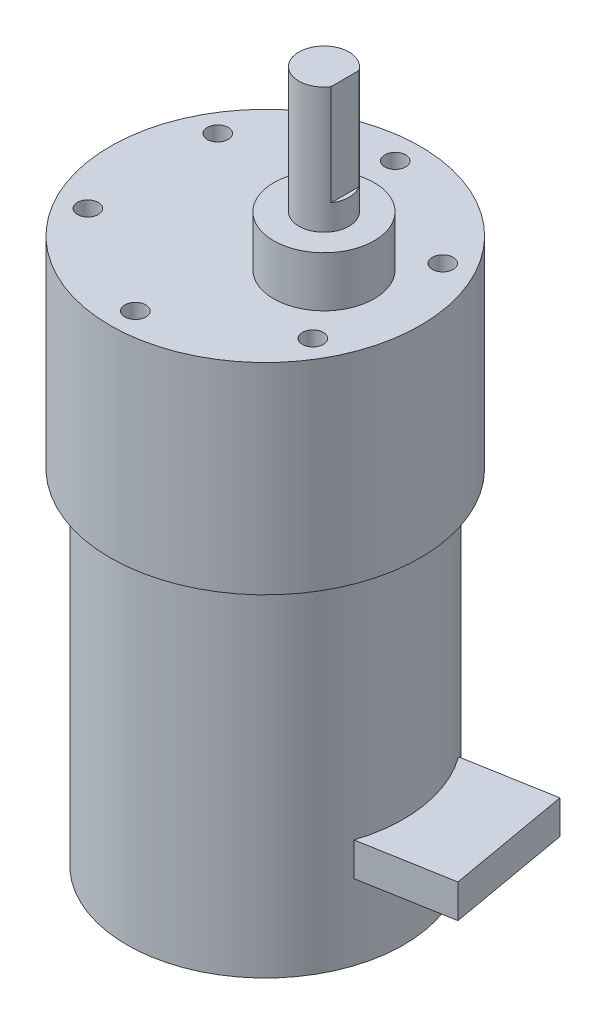
ISO-10303-21;
HEADER;
FILE_DESCRIPTION(('STEP AP214'),'2;1');
FILE_NAME('part.step','',(''),(''),'','','');
FILE_SCHEMA(('AUTOMOTIVE_DESIGN { 1 0 10303 214 1 1 1 1 }'));
ENDSEC;
DATA;
#1=APPLICATION_CONTEXT('core data for automotive mechanical design processes');
#2=APPLICATION_PROTOCOL_DEFINITION('international standard','automotive_design',2000,#1);
#3=PRODUCT_CONTEXT('',#1,'mechanical');
#4=PRODUCT('Part','Part','',(#3));
#5=PRODUCT_RELATED_PRODUCT_CATEGORY('part','',(#4));
#6=PRODUCT_DEFINITION_FORMATION('','',#4);
#7=PRODUCT_DEFINITION_CONTEXT('part definition',#1,'design');
#8=PRODUCT_DEFINITION('design','',#6,#7);
#9=PRODUCT_DEFINITION_SHAPE('','',#8);
#10=(LENGTH_UNIT() NAMED_UNIT(*) SI_UNIT(.MILLI.,.METRE.));
#11=(NAMED_UNIT(*) PLANE_ANGLE_UNIT() SI_UNIT($,.RADIAN.));
#12=(NAMED_UNIT(*) SI_UNIT($,.STERADIAN.) SOLID_ANGLE_UNIT());
#13=UNCERTAINTY_MEASURE_WITH_UNIT(LENGTH_MEASURE(1.E-05),#10,'distance_accuracy_value','');
#14=(GEOMETRIC_REPRESENTATION_CONTEXT(3) GLOBAL_UNCERTAINTY_ASSIGNED_CONTEXT((#13)) GLOBAL_UNIT_ASSIGNED_CONTEXT((#10,
#11,#12)) REPRESENTATION_CONTEXT('',''));
#15=CARTESIAN_POINT('',(0.,0.,0.));
#16=DIRECTION('',(0.,0.,1.));
#17=DIRECTION('',(1.,0.,0.));
#18=AXIS2_PLACEMENT_3D('',#15,#16,#17);
#19=CARTESIAN_POINT('',(0.,24.,0.));
#20=DIRECTION('',(0.,-1.,0.));
#21=DIRECTION('',(0.,0.,-1.));
#22=AXIS2_PLACEMENT_3D('',#19,#20,#21);
#23=CYLINDRICAL_SURFACE('',#22,18.5);
#24=CARTESIAN_POINT('',(0.,24.,0.));
#25=DIRECTION('',(0.,1.,0.));
#26=DIRECTION('',(0.,0.,1.));
#27=AXIS2_PLACEMENT_3D('',#24,#25,#26);
#28=CIRCLE('',#27,18.5);
#29=CARTESIAN_POINT('',(0.,24.,18.5));
#30=VERTEX_POINT('',#29);
#31=EDGE_CURVE('E186',#30,#30,#28,.T.);
#32=ORIENTED_EDGE('',*,*,#31,.F.);
#33=EDGE_LOOP('',(#32));
#34=FACE_BOUND('',#33,.T.);
#35=CARTESIAN_POINT('',(0.,0.,0.));
#36=DIRECTION('',(0.,1.,0.));
#37=DIRECTION('',(0.,0.,1.));
#38=AXIS2_PLACEMENT_3D('',#35,#36,#37);
#39=CIRCLE('',#38,18.5);
#40=CARTESIAN_POINT('',(0.,0.,18.5));
#41=VERTEX_POINT('',#40);
#42=EDGE_CURVE('E183',#41,#41,#39,.T.);
#43=ORIENTED_EDGE('',*,*,#42,.T.);
#44=EDGE_LOOP('',(#43));
#45=FACE_BOUND('',#44,.T.);
#46=ADVANCED_FACE('F38',(#34,#45),#23,.T.);
#47=CARTESIAN_POINT('',(0.,24.,0.));
#48=DIRECTION('',(0.,1.,0.));
#49=DIRECTION('',(0.,0.,1.));
#50=AXIS2_PLACEMENT_3D('',#47,#48,#49);
#51=PLANE('',#50);
#52=CARTESIAN_POINT('',(7.00000000000132,24.,0.));
#53=DIRECTION('',(0.,1.,0.));
#54=DIRECTION('',(0.,0.,1.));
#55=AXIS2_PLACEMENT_3D('',#52,#53,#54);
#56=CIRCLE('',#55,6.);
#57=CARTESIAN_POINT('',(7.00000000000132,24.,6.));
#58=VERTEX_POINT('',#57);
#59=EDGE_CURVE('E133',#58,#58,#56,.T.);
#60=ORIENTED_EDGE('',*,*,#59,.F.);
#61=EDGE_LOOP('',(#60));
#62=FACE_BOUND('',#61,.T.);
#63=CARTESIAN_POINT('',(0.,24.,-15.5));
#64=DIRECTION('',(0.,1.,0.));
#65=DIRECTION('',(0.,0.,1.));
#66=AXIS2_PLACEMENT_3D('',#63,#64,#65);
#67=CIRCLE('',#66,1.25);
#68=CARTESIAN_POINT('',(0.,24.,-14.25));
#69=VERTEX_POINT('',#68);
#70=EDGE_CURVE('E149',#69,#69,#67,.T.);
#71=ORIENTED_EDGE('',*,*,#70,.F.);
#72=EDGE_LOOP('',(#71));
#73=FACE_BOUND('',#72,.T.);
#74=CARTESIAN_POINT('',(-13.4233937586585,24.,-7.74999999999942));
#75=DIRECTION('',(0.,1.,0.));
#76=DIRECTION('',(0.,0.,1.));
#77=AXIS2_PLACEMENT_3D('',#74,#75,#76);
#78=CIRCLE('',#77,1.25000000000067);
#79=CARTESIAN_POINT('',(-13.4233937586585,24.,-6.49999999999875));
#80=VERTEX_POINT('',#79);
#81=EDGE_CURVE('E153',#80,#80,#78,.T.);
#82=ORIENTED_EDGE('',*,*,#81,.F.);
#83=EDGE_LOOP('',(#82));
#84=FACE_BOUND('',#83,.T.);
#85=CARTESIAN_POINT('',(-13.4233937586578,24.,7.75000000000058));
#86=DIRECTION('',(0.,1.,0.));
#87=DIRECTION('',(0.,0.,1.));
#88=AXIS2_PLACEMENT_3D('',#85,#86,#87);
#89=CIRCLE('',#88,1.25000000000125);
#90=CARTESIAN_POINT('',(-13.4233937586578,24.,9.00000000000183));
#91=VERTEX_POINT('',#90);
#92=EDGE_CURVE('E176',#91,#91,#89,.T.);
#93=ORIENTED_EDGE('',*,*,#92,.F.);
#94=EDGE_LOOP('',(#93));
#95=FACE_BOUND('',#94,.T.);
#96=CARTESIAN_POINT('',(1.31591488089775E-12,24.,15.5));
#97=DIRECTION('',(0.,1.,0.));
#98=DIRECTION('',(0.,0.,1.));
#99=AXIS2_PLACEMENT_3D('',#96,#97,#98);
#100=CIRCLE('',#99,1.25000000000136);
#101=CARTESIAN_POINT('',(1.31591488089775E-12,24.,16.7500000000014));
#102=VERTEX_POINT('',#101);
#103=EDGE_CURVE('E170',#102,#102,#100,.T.);
#104=ORIENTED_EDGE('',*,*,#103,.F.);
#105=EDGE_LOOP('',(#104));
#106=FACE_BOUND('',#105,.T.);
#107=CARTESIAN_POINT('',(13.4233937586598,24.,7.74999999999943));
#108=DIRECTION('',(0.,1.,0.));
#109=DIRECTION('',(0.,0.,1.));
#110=AXIS2_PLACEMENT_3D('',#107,#108,#109);
#111=CIRCLE('',#110,1.25000000000085);
#112=CARTESIAN_POINT('',(13.4233937586598,24.,9.00000000000028));
#113=VERTEX_POINT('',#112);
#114=EDGE_CURVE('E164',#113,#113,#111,.T.);
#115=ORIENTED_EDGE('',*,*,#114,.F.);
#116=EDGE_LOOP('',(#115));
#117=FACE_BOUND('',#116,.T.);
#118=CARTESIAN_POINT('',(13.4233937586591,24.,-7.75000000000057));
#119=DIRECTION('',(0.,1.,0.));
#120=DIRECTION('',(0.,0.,1.));
#121=AXIS2_PLACEMENT_3D('',#118,#119,#120);
#122=CIRCLE('',#121,1.25000000000019);
#123=CARTESIAN_POINT('',(13.4233937586591,24.,-6.50000000000039));
#124=VERTEX_POINT('',#123);
#125=EDGE_CURVE('E152',#124,#124,#122,.T.);
#126=ORIENTED_EDGE('',*,*,#125,.F.);
#127=EDGE_LOOP('',(#126));
#128=FACE_BOUND('',#127,.T.);
#129=ORIENTED_EDGE('',*,*,#31,.T.);
#130=EDGE_LOOP('',(#129));
#131=FACE_BOUND('',#130,.T.);
#132=ADVANCED_FACE('F214',(#62,#73,#84,#95,#106,#117,#128,#131),#51,.T.);
#133=CARTESIAN_POINT('',(0.,0.,0.));
#134=DIRECTION('',(0.,1.,0.));
#135=DIRECTION('',(0.,0.,1.));
#136=AXIS2_PLACEMENT_3D('',#133,#134,#135);
#137=PLANE('',#136);
#138=CARTESIAN_POINT('',(0.,0.,0.));
#139=DIRECTION('',(0.,-1.,0.));
#140=DIRECTION('',(0.,0.,-1.));
#141=AXIS2_PLACEMENT_3D('',#138,#139,#140);
#142=CIRCLE('',#141,16.5);
#143=CARTESIAN_POINT('',(0.,0.,-16.5));
#144=VERTEX_POINT('',#143);
#145=EDGE_CURVE('E138',#144,#144,#142,.T.);
#146=ORIENTED_EDGE('',*,*,#145,.F.);
#147=EDGE_LOOP('',(#146));
#148=FACE_BOUND('',#147,.T.);
#149=ORIENTED_EDGE('',*,*,#42,.F.);
#150=EDGE_LOOP('',(#149));
#151=FACE_BOUND('',#150,.T.);
#152=ADVANCED_FACE('F219',(#148,#151),#137,.F.);
#153=CARTESIAN_POINT('',(0.,-41.,0.));
#154=DIRECTION('',(0.,1.,0.));
#155=DIRECTION('',(0.,0.,1.));
#156=AXIS2_PLACEMENT_3D('',#153,#154,#155);
#157=CYLINDRICAL_SURFACE('',#156,16.5);
#158=DIRECTION('',(0.,1.,0.));
#159=VECTOR('',#158,1.);
#160=CARTESIAN_POINT('',(15.689600978238,-41.,5.10748677371484));
#161=LINE('',#160,#159);
#162=CARTESIAN_POINT('',(15.689600978238,-32.,5.10748677371484));
#163=VERTEX_POINT('',#162);
#164=CARTESIAN_POINT('',(15.689600978238,-28.,5.10748677371484));
#165=VERTEX_POINT('',#164);
#166=EDGE_CURVE('E137',#163,#165,#161,.T.);
#167=ORIENTED_EDGE('',*,*,#166,.T.);
#168=CARTESIAN_POINT('',(0.,-28.,0.));
#169=DIRECTION('',(0.,1.,0.));
#170=DIRECTION('',(0.,0.,1.));
#171=AXIS2_PLACEMENT_3D('',#168,#169,#170);
#172=CIRCLE('',#171,16.5);
#173=CARTESIAN_POINT('',(13.3405909040552,-28.,-9.7097185505369));
#174=VERTEX_POINT('',#173);
#175=EDGE_CURVE('E11',#165,#174,#172,.T.);
#176=ORIENTED_EDGE('',*,*,#175,.T.);
#177=DIRECTION('',(0.,1.,0.));
#178=VECTOR('',#177,1.);
#179=CARTESIAN_POINT('',(13.3405909040552,-41.,-9.7097185505369));
#180=LINE('',#179,#178);
#181=CARTESIAN_POINT('',(13.3405909040552,-32.,-9.7097185505369));
#182=VERTEX_POINT('',#181);
#183=EDGE_CURVE('E45',#174,#182,#180,.F.);
#184=ORIENTED_EDGE('',*,*,#183,.T.);
#185=CARTESIAN_POINT('',(0.,-32.,0.));
#186=DIRECTION('',(0.,-1.,0.));
#187=DIRECTION('',(0.,0.,-1.));
#188=AXIS2_PLACEMENT_3D('',#185,#186,#187);
#189=CIRCLE('',#188,16.5);
#190=EDGE_CURVE('E192',#182,#163,#189,.T.);
#191=ORIENTED_EDGE('',*,*,#190,.T.);
#192=EDGE_LOOP('',(#167,#176,#184,#191));
#193=FACE_BOUND('',#192,.T.);
#194=CARTESIAN_POINT('',(0.,-41.,0.));
#195=DIRECTION('',(0.,-1.,0.));
#196=DIRECTION('',(0.,0.,-1.));
#197=AXIS2_PLACEMENT_3D('',#194,#195,#196);
#198=CIRCLE('',#197,16.5);
#199=CARTESIAN_POINT('',(0.,-41.,-16.5));
#200=VERTEX_POINT('',#199);
#201=EDGE_CURVE('E148',#200,#200,#198,.T.);
#202=ORIENTED_EDGE('',*,*,#201,.F.);
#203=EDGE_LOOP('',(#202));
#204=FACE_BOUND('',#203,.T.);
#205=ORIENTED_EDGE('',*,*,#145,.T.);
#206=EDGE_LOOP('',(#205));
#207=FACE_BOUND('',#206,.T.);
#208=ADVANCED_FACE('F196',(#193,#204,#207),#157,.T.);
#209=CARTESIAN_POINT('',(0.,-41.,0.));
#210=DIRECTION('',(0.,-1.,0.));
#211=DIRECTION('',(0.,0.,-1.));
#212=AXIS2_PLACEMENT_3D('',#209,#210,#211);
#213=PLANE('',#212);
#214=ORIENTED_EDGE('',*,*,#201,.T.);
#215=EDGE_LOOP('',(#214));
#216=FACE_BOUND('',#215,.T.);
#217=ADVANCED_FACE('F231',(#216),#213,.T.);
#218=CARTESIAN_POINT('',(13.4233937586591,20.5,-7.75000000000057));
#219=DIRECTION('',(0.,1.,0.));
#220=DIRECTION('',(0.,0.,1.));
#221=AXIS2_PLACEMENT_3D('',#218,#219,#220);
#222=CYLINDRICAL_SURFACE('',#221,1.25000000000019);
#223=CARTESIAN_POINT('',(13.4233937586591,20.5,-7.75000000000057));
#224=DIRECTION('',(0.,1.,0.));
#225=DIRECTION('',(0.,0.,1.));
#226=AXIS2_PLACEMENT_3D('',#223,#224,#225);
#227=CIRCLE('',#226,1.25000000000019);
#228=CARTESIAN_POINT('',(13.4233937586591,20.5,-6.50000000000039));
#229=VERTEX_POINT('',#228);
#230=EDGE_CURVE('E161',#229,#229,#227,.T.);
#231=ORIENTED_EDGE('',*,*,#230,.F.);
#232=EDGE_LOOP('',(#231));
#233=FACE_BOUND('',#232,.T.);
#234=ORIENTED_EDGE('',*,*,#125,.T.);
#235=EDGE_LOOP('',(#234));
#236=FACE_BOUND('',#235,.T.);
#237=ADVANCED_FACE('F237',(#233,#236),#222,.F.);
#238=CARTESIAN_POINT('',(13.4233937586591,20.5,-7.75000000000057));
#239=DIRECTION('',(0.,1.,0.));
#240=DIRECTION('',(0.,0.,1.));
#241=AXIS2_PLACEMENT_3D('',#238,#239,#240);
#242=PLANE('',#241);
#243=ORIENTED_EDGE('',*,*,#230,.T.);
#244=EDGE_LOOP('',(#243));
#245=FACE_BOUND('',#244,.T.);
#246=ADVANCED_FACE('F263',(#245),#242,.T.);
#247=CARTESIAN_POINT('',(13.4233937586598,20.5,7.74999999999943));
#248=DIRECTION('',(0.,1.,0.));
#249=DIRECTION('',(0.,0.,1.));
#250=AXIS2_PLACEMENT_3D('',#247,#248,#249);
#251=CYLINDRICAL_SURFACE('',#250,1.25000000000085);
#252=CARTESIAN_POINT('',(13.4233937586598,20.5,7.74999999999943));
#253=DIRECTION('',(0.,1.,0.));
#254=DIRECTION('',(0.,0.,1.));
#255=AXIS2_PLACEMENT_3D('',#252,#253,#254);
#256=CIRCLE('',#255,1.25000000000085);
#257=CARTESIAN_POINT('',(13.4233937586598,20.5,9.00000000000028));
#258=VERTEX_POINT('',#257);
#259=EDGE_CURVE('E167',#258,#258,#256,.T.);
#260=ORIENTED_EDGE('',*,*,#259,.F.);
#261=EDGE_LOOP('',(#260));
#262=FACE_BOUND('',#261,.T.);
#263=ORIENTED_EDGE('',*,*,#114,.T.);
#264=EDGE_LOOP('',(#263));
#265=FACE_BOUND('',#264,.T.);
#266=ADVANCED_FACE('F259',(#262,#265),#251,.F.);
#267=CARTESIAN_POINT('',(13.4233937586598,20.5,7.74999999999943));
#268=DIRECTION('',(0.,1.,0.));
#269=DIRECTION('',(0.,0.,1.));
#270=AXIS2_PLACEMENT_3D('',#267,#268,#269);
#271=PLANE('',#270);
#272=ORIENTED_EDGE('',*,*,#259,.T.);
#273=EDGE_LOOP('',(#272));
#274=FACE_BOUND('',#273,.T.);
#275=ADVANCED_FACE('F255',(#274),#271,.T.);
#276=CARTESIAN_POINT('',(1.31591488089775E-12,20.5,15.5));
#277=DIRECTION('',(0.,1.,0.));
#278=DIRECTION('',(0.,0.,1.));
#279=AXIS2_PLACEMENT_3D('',#276,#277,#278);
#280=CYLINDRICAL_SURFACE('',#279,1.25000000000136);
#281=CARTESIAN_POINT('',(1.31591488089775E-12,20.5,15.5));
#282=DIRECTION('',(0.,1.,0.));
#283=DIRECTION('',(0.,0.,1.));
#284=AXIS2_PLACEMENT_3D('',#281,#282,#283);
#285=CIRCLE('',#284,1.25000000000136);
#286=CARTESIAN_POINT('',(1.31591488089775E-12,20.5,16.7500000000014));
#287=VERTEX_POINT('',#286);
#288=EDGE_CURVE('E173',#287,#287,#285,.T.);
#289=ORIENTED_EDGE('',*,*,#288,.F.);
#290=EDGE_LOOP('',(#289));
#291=FACE_BOUND('',#290,.T.);
#292=ORIENTED_EDGE('',*,*,#103,.T.);
#293=EDGE_LOOP('',(#292));
#294=FACE_BOUND('',#293,.T.);
#295=ADVANCED_FACE('F251',(#291,#294),#280,.F.);
#296=CARTESIAN_POINT('',(1.31591488089775E-12,20.5,15.5));
#297=DIRECTION('',(0.,1.,0.));
#298=DIRECTION('',(0.,0.,1.));
#299=AXIS2_PLACEMENT_3D('',#296,#297,#298);
#300=PLANE('',#299);
#301=ORIENTED_EDGE('',*,*,#288,.T.);
#302=EDGE_LOOP('',(#301));
#303=FACE_BOUND('',#302,.T.);
#304=ADVANCED_FACE('F247',(#303),#300,.T.);
#305=CARTESIAN_POINT('',(-13.4233937586578,20.5,7.75000000000058));
#306=DIRECTION('',(0.,1.,0.));
#307=DIRECTION('',(0.,0.,1.));
#308=AXIS2_PLACEMENT_3D('',#305,#306,#307);
#309=CYLINDRICAL_SURFACE('',#308,1.25000000000125);
#310=CARTESIAN_POINT('',(-13.4233937586578,20.5,7.75000000000058));
#311=DIRECTION('',(0.,1.,0.));
#312=DIRECTION('',(0.,0.,1.));
#313=AXIS2_PLACEMENT_3D('',#310,#311,#312);
#314=CIRCLE('',#313,1.25000000000125);
#315=CARTESIAN_POINT('',(-13.4233937586578,20.5,9.00000000000183));
#316=VERTEX_POINT('',#315);
#317=EDGE_CURVE('E156',#316,#316,#314,.T.);
#318=ORIENTED_EDGE('',*,*,#317,.F.);
#319=EDGE_LOOP('',(#318));
#320=FACE_BOUND('',#319,.T.);
#321=ORIENTED_EDGE('',*,*,#92,.T.);
#322=EDGE_LOOP('',(#321));
#323=FACE_BOUND('',#322,.T.);
#324=ADVANCED_FACE('F243',(#320,#323),#309,.F.);
#325=CARTESIAN_POINT('',(-13.4233937586578,20.5,7.75000000000058));
#326=DIRECTION('',(0.,1.,0.));
#327=DIRECTION('',(0.,0.,1.));
#328=AXIS2_PLACEMENT_3D('',#325,#326,#327);
#329=PLANE('',#328);
#330=ORIENTED_EDGE('',*,*,#317,.T.);
#331=EDGE_LOOP('',(#330));
#332=FACE_BOUND('',#331,.T.);
#333=ADVANCED_FACE('F239',(#332),#329,.T.);
#334=CARTESIAN_POINT('',(-13.4233937586585,20.5,-7.74999999999942));
#335=DIRECTION('',(0.,1.,0.));
#336=DIRECTION('',(0.,0.,1.));
#337=AXIS2_PLACEMENT_3D('',#334,#335,#336);
#338=CYLINDRICAL_SURFACE('',#337,1.25000000000067);
#339=CARTESIAN_POINT('',(-13.4233937586585,20.5,-7.74999999999942));
#340=DIRECTION('',(0.,1.,0.));
#341=DIRECTION('',(0.,0.,1.));
#342=AXIS2_PLACEMENT_3D('',#339,#340,#341);
#343=CIRCLE('',#342,1.25000000000067);
#344=CARTESIAN_POINT('',(-13.4233937586585,20.5,-6.49999999999875));
#345=VERTEX_POINT('',#344);
#346=EDGE_CURVE('E142',#345,#345,#343,.T.);
#347=ORIENTED_EDGE('',*,*,#346,.F.);
#348=EDGE_LOOP('',(#347));
#349=FACE_BOUND('',#348,.T.);
#350=ORIENTED_EDGE('',*,*,#81,.T.);
#351=EDGE_LOOP('',(#350));
#352=FACE_BOUND('',#351,.T.);
#353=ADVANCED_FACE('F242',(#349,#352),#338,.F.);
#354=CARTESIAN_POINT('',(-13.4233937586585,20.5,-7.74999999999942));
#355=DIRECTION('',(0.,1.,0.));
#356=DIRECTION('',(0.,0.,1.));
#357=AXIS2_PLACEMENT_3D('',#354,#355,#356);
#358=PLANE('',#357);
#359=ORIENTED_EDGE('',*,*,#346,.T.);
#360=EDGE_LOOP('',(#359));
#361=FACE_BOUND('',#360,.T.);
#362=ADVANCED_FACE('F271',(#361),#358,.T.);
#363=CARTESIAN_POINT('',(0.,20.5,-15.5));
#364=DIRECTION('',(0.,1.,0.));
#365=DIRECTION('',(0.,0.,1.));
#366=AXIS2_PLACEMENT_3D('',#363,#364,#365);
#367=CYLINDRICAL_SURFACE('',#366,1.25);
#368=CARTESIAN_POINT('',(0.,20.5,-15.5));
#369=DIRECTION('',(0.,1.,0.));
#370=DIRECTION('',(0.,0.,1.));
#371=AXIS2_PLACEMENT_3D('',#368,#369,#370);
#372=CIRCLE('',#371,1.25);
#373=CARTESIAN_POINT('',(0.,20.5,-14.25));
#374=VERTEX_POINT('',#373);
#375=EDGE_CURVE('E145',#374,#374,#372,.T.);
#376=ORIENTED_EDGE('',*,*,#375,.F.);
#377=EDGE_LOOP('',(#376));
#378=FACE_BOUND('',#377,.T.);
#379=ORIENTED_EDGE('',*,*,#70,.T.);
#380=EDGE_LOOP('',(#379));
#381=FACE_BOUND('',#380,.T.);
#382=ADVANCED_FACE('F274',(#378,#381),#367,.F.);
#383=CARTESIAN_POINT('',(0.,20.5,-15.5));
#384=DIRECTION('',(0.,1.,0.));
#385=DIRECTION('',(0.,0.,1.));
#386=AXIS2_PLACEMENT_3D('',#383,#384,#385);
#387=PLANE('',#386);
#388=ORIENTED_EDGE('',*,*,#375,.T.);
#389=EDGE_LOOP('',(#388));
#390=FACE_BOUND('',#389,.T.);
#391=ADVANCED_FACE('F281',(#390),#387,.T.);
#392=CARTESIAN_POINT('',(7.00000000000132,30.,0.));
#393=DIRECTION('',(0.,-1.,0.));
#394=DIRECTION('',(0.,0.,-1.));
#395=AXIS2_PLACEMENT_3D('',#392,#393,#394);
#396=CYLINDRICAL_SURFACE('',#395,6.);
#397=CARTESIAN_POINT('',(7.00000000000132,30.,0.));
#398=DIRECTION('',(0.,1.,0.));
#399=DIRECTION('',(0.,0.,1.));
#400=AXIS2_PLACEMENT_3D('',#397,#398,#399);
#401=CIRCLE('',#400,6.);
#402=CARTESIAN_POINT('',(7.00000000000132,30.,6.));
#403=VERTEX_POINT('',#402);
#404=EDGE_CURVE('E139',#403,#403,#401,.T.);
#405=ORIENTED_EDGE('',*,*,#404,.F.);
#406=EDGE_LOOP('',(#405));
#407=FACE_BOUND('',#406,.T.);
#408=ORIENTED_EDGE('',*,*,#59,.T.);
#409=EDGE_LOOP('',(#408));
#410=FACE_BOUND('',#409,.T.);
#411=ADVANCED_FACE('F285',(#407,#410),#396,.T.);
#412=CARTESIAN_POINT('',(7.00000000000132,30.,0.));
#413=DIRECTION('',(0.,1.,0.));
#414=DIRECTION('',(0.,0.,1.));
#415=AXIS2_PLACEMENT_3D('',#412,#413,#414);
#416=PLANE('',#415);
#417=CARTESIAN_POINT('',(7.00000000000132,30.,0.));
#418=DIRECTION('',(0.,1.,0.));
#419=DIRECTION('',(0.,0.,1.));
#420=AXIS2_PLACEMENT_3D('',#417,#418,#419);
#421=CIRCLE('',#420,3.);
#422=CARTESIAN_POINT('',(7.00000000000132,30.,3.));
#423=VERTEX_POINT('',#422);
#424=EDGE_CURVE('E134',#423,#423,#421,.T.);
#425=ORIENTED_EDGE('',*,*,#424,.F.);
#426=EDGE_LOOP('',(#425));
#427=FACE_BOUND('',#426,.T.);
#428=ORIENTED_EDGE('',*,*,#404,.T.);
#429=EDGE_LOOP('',(#428));
#430=FACE_BOUND('',#429,.T.);
#431=ADVANCED_FACE('F289',(#427,#430),#416,.T.);
#432=CARTESIAN_POINT('',(7.00000000000132,45.,0.));
#433=DIRECTION('',(0.,-1.,0.));
#434=DIRECTION('',(0.,0.,-1.));
#435=AXIS2_PLACEMENT_3D('',#432,#433,#434);
#436=CYLINDRICAL_SURFACE('',#435,3.);
#437=CARTESIAN_POINT('',(7.00000000000132,45.,0.));
#438=DIRECTION('',(0.,1.,0.));
#439=DIRECTION('',(0.,0.,1.));
#440=AXIS2_PLACEMENT_3D('',#437,#438,#439);
#441=CIRCLE('',#440,3.);
#442=CARTESIAN_POINT('',(9.50000000000132,45.,-1.6583123951777));
#443=VERTEX_POINT('',#442);
#444=CARTESIAN_POINT('',(9.50000000000132,45.,1.6583123951777));
#445=VERTEX_POINT('',#444);
#446=EDGE_CURVE('E129',#443,#445,#441,.T.);
#447=ORIENTED_EDGE('',*,*,#446,.F.);
#448=DIRECTION('',(0.,1.,0.));
#449=VECTOR('',#448,1.);
#450=CARTESIAN_POINT('',(9.50000000000132,33.,-1.6583123951777));
#451=LINE('',#450,#449);
#452=CARTESIAN_POINT('',(9.50000000000132,33.,-1.6583123951777));
#453=VERTEX_POINT('',#452);
#454=EDGE_CURVE('E60',#453,#443,#451,.T.);
#455=ORIENTED_EDGE('',*,*,#454,.F.);
#456=CARTESIAN_POINT('',(7.00000000000132,33.,0.));
#457=DIRECTION('',(0.,1.,0.));
#458=DIRECTION('',(0.,0.,1.));
#459=AXIS2_PLACEMENT_3D('',#456,#457,#458);
#460=CIRCLE('',#459,3.);
#461=CARTESIAN_POINT('',(9.50000000000132,33.,1.6583123951777));
#462=VERTEX_POINT('',#461);
#463=EDGE_CURVE('E120',#462,#453,#460,.T.);
#464=ORIENTED_EDGE('',*,*,#463,.F.);
#465=DIRECTION('',(0.,1.,0.));
#466=VECTOR('',#465,1.);
#467=CARTESIAN_POINT('',(9.50000000000132,33.,1.6583123951777));
#468=LINE('',#467,#466);
#469=EDGE_CURVE('E126',#462,#445,#468,.T.);
#470=ORIENTED_EDGE('',*,*,#469,.T.);
#471=EDGE_LOOP('',(#447,#455,#464,#470));
#472=FACE_BOUND('',#471,.T.);
#473=ORIENTED_EDGE('',*,*,#424,.T.);
#474=EDGE_LOOP('',(#473));
#475=FACE_BOUND('',#474,.T.);
#476=ADVANCED_FACE('F293',(#472,#475),#436,.T.);
#477=CARTESIAN_POINT('',(7.00000000000132,45.,0.));
#478=DIRECTION('',(0.,1.,0.));
#479=DIRECTION('',(0.,0.,1.));
#480=AXIS2_PLACEMENT_3D('',#477,#478,#479);
#481=PLANE('',#480);
#482=DIRECTION('',(0.,0.,1.));
#483=VECTOR('',#482,1.);
#484=CARTESIAN_POINT('',(9.50000000000132,45.,-1.6583123951777));
#485=LINE('',#484,#483);
#486=EDGE_CURVE('E116',#443,#445,#485,.T.);
#487=ORIENTED_EDGE('',*,*,#486,.F.);
#488=ORIENTED_EDGE('',*,*,#446,.T.);
#489=EDGE_LOOP('',(#487,#488));
#490=FACE_BOUND('',#489,.T.);
#491=ADVANCED_FACE('F297',(#490),#481,.T.);
#492=CARTESIAN_POINT('',(9.50000000000132,33.,-1.6583123951777));
#493=DIRECTION('',(-1.,0.,0.));
#494=DIRECTION('',(0.,0.,1.));
#495=AXIS2_PLACEMENT_3D('',#492,#493,#494);
#496=PLANE('',#495);
#497=ORIENTED_EDGE('',*,*,#486,.T.);
#498=ORIENTED_EDGE('',*,*,#469,.F.);
#499=DIRECTION('',(0.,0.,1.));
#500=VECTOR('',#499,1.);
#501=CARTESIAN_POINT('',(9.50000000000132,33.,-1.6583123951777));
#502=LINE('',#501,#500);
#503=EDGE_CURVE('E122',#453,#462,#502,.T.);
#504=ORIENTED_EDGE('',*,*,#503,.F.);
#505=ORIENTED_EDGE('',*,*,#454,.T.);
#506=EDGE_LOOP('',(#497,#498,#504,#505));
#507=FACE_BOUND('',#506,.T.);
#508=ADVANCED_FACE('F301',(#507),#496,.F.);
#509=CARTESIAN_POINT('',(7.00000000000132,33.,0.));
#510=DIRECTION('',(0.,1.,0.));
#511=DIRECTION('',(0.,0.,1.));
#512=AXIS2_PLACEMENT_3D('',#509,#510,#511);
#513=PLANE('',#512);
#514=ORIENTED_EDGE('',*,*,#463,.T.);
#515=ORIENTED_EDGE('',*,*,#503,.T.);
#516=EDGE_LOOP('',(#514,#515));
#517=FACE_BOUND('',#516,.T.);
#518=ADVANCED_FACE('F305',(#517),#513,.T.);
#519=CARTESIAN_POINT('',(6.36126595719764,-28.,-8.47907525527424));
#520=DIRECTION('',(-0.173648177666931,0.,-0.984807753012208));
#521=DIRECTION('',(-0.984807753012208,0.,0.173648177666931));
#522=AXIS2_PLACEMENT_3D('',#519,#520,#521);
#523=PLANE('',#522);
#524=ORIENTED_EDGE('',*,*,#183,.F.);
#525=DIRECTION('',(0.984807753012208,0.,-0.173648177666931));
#526=VECTOR('',#525,1.);
#527=CARTESIAN_POINT('',(6.36126595719764,-28.,-8.47907525527424));
#528=LINE('',#527,#526);
#529=CARTESIAN_POINT('',(23.6210066364896,-28.,-11.5224332170649));
#530=VERTEX_POINT('',#529);
#531=EDGE_CURVE('E114',#174,#530,#528,.T.);
#532=ORIENTED_EDGE('',*,*,#531,.T.);
#533=DIRECTION('',(0.,1.,0.));
#534=VECTOR('',#533,1.);
#535=CARTESIAN_POINT('',(23.6210066364896,-28.,-11.5224332170649));
#536=LINE('',#535,#534);
#537=CARTESIAN_POINT('',(23.6210066364896,-32.,-11.5224332170649));
#538=VERTEX_POINT('',#537);
#539=EDGE_CURVE('E97',#538,#530,#536,.T.);
#540=ORIENTED_EDGE('',*,*,#539,.F.);
#541=DIRECTION('',(0.984807753012208,0.,-0.173648177666931));
#542=VECTOR('',#541,1.);
#543=CARTESIAN_POINT('',(6.36126595719764,-32.,-8.47907525527424));
#544=LINE('',#543,#542);
#545=EDGE_CURVE('E117',#182,#538,#544,.T.);
#546=ORIENTED_EDGE('',*,*,#545,.F.);
#547=EDGE_LOOP('',(#524,#532,#540,#546));
#548=FACE_BOUND('',#547,.T.);
#549=ADVANCED_FACE('F200',(#548),#523,.T.);
#550=CARTESIAN_POINT('',(8.9659886222016,-28.,6.29304103990888));
#551=DIRECTION('',(0.173648177666931,0.,0.984807753012208));
#552=DIRECTION('',(0.984807753012208,0.,-0.173648177666931));
#553=AXIS2_PLACEMENT_3D('',#550,#551,#552);
#554=PLANE('',#553);
#555=ORIENTED_EDGE('',*,*,#166,.F.);
#556=DIRECTION('',(0.984807753012208,0.,-0.173648177666931));
#557=VECTOR('',#556,1.);
#558=CARTESIAN_POINT('',(8.9659886222016,-32.,6.29304103990888));
#559=LINE('',#558,#557);
#560=CARTESIAN_POINT('',(26.2257293014936,-32.,3.24968307811825));
#561=VERTEX_POINT('',#560);
#562=EDGE_CURVE('E96',#163,#561,#559,.T.);
#563=ORIENTED_EDGE('',*,*,#562,.T.);
#564=DIRECTION('',(0.,-1.,0.));
#565=VECTOR('',#564,1.);
#566=CARTESIAN_POINT('',(26.2257293014936,-28.,3.24968307811825));
#567=LINE('',#566,#565);
#568=CARTESIAN_POINT('',(26.2257293014936,-28.,3.24968307811825));
#569=VERTEX_POINT('',#568);
#570=EDGE_CURVE('E100',#569,#561,#567,.T.);
#571=ORIENTED_EDGE('',*,*,#570,.F.);
#572=DIRECTION('',(0.984807753012208,0.,-0.173648177666931));
#573=VECTOR('',#572,1.);
#574=CARTESIAN_POINT('',(8.9659886222016,-28.,6.29304103990888));
#575=LINE('',#574,#573);
#576=EDGE_CURVE('E52',#165,#569,#575,.T.);
#577=ORIENTED_EDGE('',*,*,#576,.F.);
#578=EDGE_LOOP('',(#555,#563,#571,#577));
#579=FACE_BOUND('',#578,.T.);
#580=ADVANCED_FACE('F101',(#579),#554,.T.);
#581=CARTESIAN_POINT('',(8.9659886222016,-28.,6.29304103990888));
#582=DIRECTION('',(0.,1.,0.));
#583=DIRECTION('',(0.,0.,1.));
#584=AXIS2_PLACEMENT_3D('',#581,#582,#583);
#585=PLANE('',#584);
#586=ORIENTED_EDGE('',*,*,#175,.F.);
#587=ORIENTED_EDGE('',*,*,#576,.T.);
#588=DIRECTION('',(0.173648177666931,0.,0.984807753012208));
#589=VECTOR('',#588,1.);
#590=CARTESIAN_POINT('',(26.2257293014936,-28.,3.24968307811825));
#591=LINE('',#590,#589);
#592=EDGE_CURVE('E93',#530,#569,#591,.T.);
#593=ORIENTED_EDGE('',*,*,#592,.F.);
#594=ORIENTED_EDGE('',*,*,#531,.F.);
#595=EDGE_LOOP('',(#586,#587,#593,#594));
#596=FACE_BOUND('',#595,.T.);
#597=ADVANCED_FACE('F90',(#596),#585,.T.);
#598=CARTESIAN_POINT('',(8.9659886222016,-32.,6.29304103990888));
#599=DIRECTION('',(0.,-1.,0.));
#600=DIRECTION('',(0.,0.,-1.));
#601=AXIS2_PLACEMENT_3D('',#598,#599,#600);
#602=PLANE('',#601);
#603=ORIENTED_EDGE('',*,*,#190,.F.);
#604=ORIENTED_EDGE('',*,*,#545,.T.);
#605=DIRECTION('',(-0.173648177666931,0.,-0.984807753012208));
#606=VECTOR('',#605,1.);
#607=CARTESIAN_POINT('',(26.2257293014936,-32.,3.24968307811825));
#608=LINE('',#607,#606);
#609=EDGE_CURVE('E106',#561,#538,#608,.T.);
#610=ORIENTED_EDGE('',*,*,#609,.F.);
#611=ORIENTED_EDGE('',*,*,#562,.F.);
#612=EDGE_LOOP('',(#603,#604,#610,#611));
#613=FACE_BOUND('',#612,.T.);
#614=ADVANCED_FACE('F202',(#613),#602,.T.);
#615=CARTESIAN_POINT('',(24.8791982643474,0.,-4.38687391239967));
#616=DIRECTION('',(-0.984807753012208,0.,0.173648177666931));
#617=DIRECTION('',(0.173648177666931,0.,0.984807753012208));
#618=AXIS2_PLACEMENT_3D('',#615,#616,#617);
#619=PLANE('',#618);
#620=ORIENTED_EDGE('',*,*,#592,.T.);
#621=ORIENTED_EDGE('',*,*,#570,.T.);
#622=ORIENTED_EDGE('',*,*,#609,.T.);
#623=ORIENTED_EDGE('',*,*,#539,.T.);
#624=EDGE_LOOP('',(#620,#621,#622,#623));
#625=FACE_BOUND('',#624,.T.);
#626=ADVANCED_FACE('F108',(#625),#619,.F.);
#627=CLOSED_SHELL('',(#46,#132,#152,#208,#217,#237,#246,#266,#275,#295,#304,#324,#333,#353,#362,
#382,#391,#411,#431,#476,#491,#508,#518,#549,#580,#597,#614,#626));
#628=MANIFOLD_SOLID_BREP('B2',#627);
#629=ADVANCED_BREP_SHAPE_REPRESENTATION('',(#18,#628),#14);
#630=SHAPE_DEFINITION_REPRESENTATION(#9,#629);
ENDSEC;
END-ISO-10303-21;
